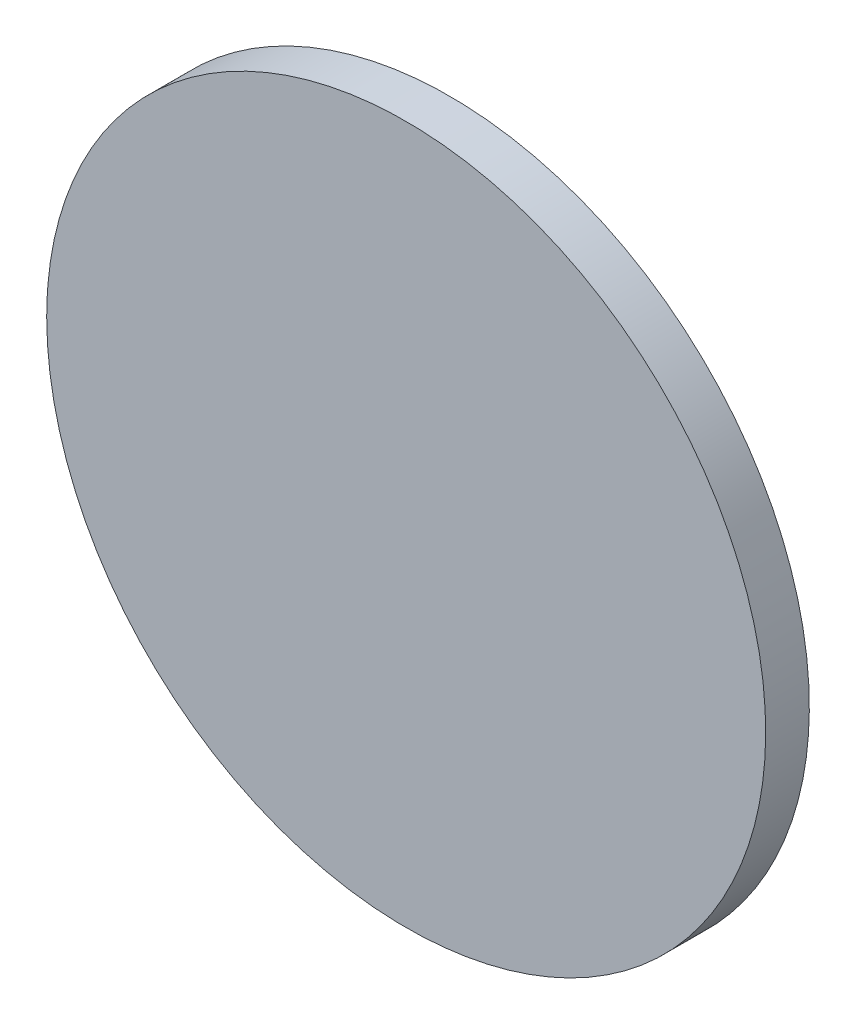
ISO-10303-21;
HEADER;
FILE_DESCRIPTION(('STEP AP214'),'2;1');
FILE_NAME('part.step','',(''),(''),'','','');
FILE_SCHEMA(('AUTOMOTIVE_DESIGN { 1 0 10303 214 1 1 1 1 }'));
ENDSEC;
DATA;
#1=APPLICATION_CONTEXT('core data for automotive mechanical design processes');
#2=APPLICATION_PROTOCOL_DEFINITION('international standard','automotive_design',2000,#1);
#3=PRODUCT_CONTEXT('',#1,'mechanical');
#4=PRODUCT('Part','Part','',(#3));
#5=PRODUCT_RELATED_PRODUCT_CATEGORY('part','',(#4));
#6=PRODUCT_DEFINITION_FORMATION('','',#4);
#7=PRODUCT_DEFINITION_CONTEXT('part definition',#1,'design');
#8=PRODUCT_DEFINITION('design','',#6,#7);
#9=PRODUCT_DEFINITION_SHAPE('','',#8);
#10=(LENGTH_UNIT() NAMED_UNIT(*) SI_UNIT(.MILLI.,.METRE.));
#11=(NAMED_UNIT(*) PLANE_ANGLE_UNIT() SI_UNIT($,.RADIAN.));
#12=(NAMED_UNIT(*) SI_UNIT($,.STERADIAN.) SOLID_ANGLE_UNIT());
#13=UNCERTAINTY_MEASURE_WITH_UNIT(LENGTH_MEASURE(1.E-05),#10,'distance_accuracy_value','');
#14=(GEOMETRIC_REPRESENTATION_CONTEXT(3) GLOBAL_UNCERTAINTY_ASSIGNED_CONTEXT((#13)) GLOBAL_UNIT_ASSIGNED_CONTEXT((#10,
#11,#12)) REPRESENTATION_CONTEXT('',''));
#15=CARTESIAN_POINT('',(0.,0.,0.));
#16=DIRECTION('',(0.,0.,1.));
#17=DIRECTION('',(1.,0.,0.));
#18=AXIS2_PLACEMENT_3D('',#15,#16,#17);
#19=CARTESIAN_POINT('',(0.,0.,3.175));
#20=DIRECTION('',(0.,0.,1.));
#21=DIRECTION('',(-1.,0.,0.));
#22=AXIS2_PLACEMENT_3D('',#19,#20,#21);
#23=ELLIPSE('',#22,26.1547347021971,25.4);
#24=DIRECTION('',(0.,0.,-1.));
#25=VECTOR('',#24,1.);
#26=SURFACE_OF_LINEAR_EXTRUSION('',#23,#25);
#27=CARTESIAN_POINT('',(-26.1547347021971,0.,3.175));
#28=VERTEX_POINT('',#27);
#29=EDGE_CURVE('E10',#28,#28,#23,.T.);
#30=ORIENTED_EDGE('',*,*,#29,.F.);
#31=EDGE_LOOP('',(#30));
#32=FACE_BOUND('',#31,.T.);
#33=CARTESIAN_POINT('',(0.,0.,0.));
#34=DIRECTION('',(0.,0.,1.));
#35=DIRECTION('',(-1.,0.,0.));
#36=AXIS2_PLACEMENT_3D('',#33,#34,#35);
#37=ELLIPSE('',#36,26.1547347021971,25.4);
#38=CARTESIAN_POINT('',(-26.1547347021971,0.,0.));
#39=VERTEX_POINT('',#38);
#40=EDGE_CURVE('E35',#39,#39,#37,.T.);
#41=ORIENTED_EDGE('',*,*,#40,.T.);
#42=EDGE_LOOP('',(#41));
#43=FACE_BOUND('',#42,.T.);
#44=ADVANCED_FACE('F31',(#32,#43),#26,.F.);
#45=CARTESIAN_POINT('',(0.,0.,3.175));
#46=DIRECTION('',(0.,0.,1.));
#47=DIRECTION('',(1.,0.,0.));
#48=AXIS2_PLACEMENT_3D('',#45,#46,#47);
#49=PLANE('',#48);
#50=ORIENTED_EDGE('',*,*,#29,.T.);
#51=EDGE_LOOP('',(#50));
#52=FACE_BOUND('',#51,.T.);
#53=ADVANCED_FACE('F47',(#52),#49,.T.);
#54=CARTESIAN_POINT('',(0.,0.,0.));
#55=DIRECTION('',(0.,0.,1.));
#56=DIRECTION('',(1.,0.,0.));
#57=AXIS2_PLACEMENT_3D('',#54,#55,#56);
#58=PLANE('',#57);
#59=ORIENTED_EDGE('',*,*,#40,.F.);
#60=EDGE_LOOP('',(#59));
#61=FACE_BOUND('',#60,.T.);
#62=ADVANCED_FACE('F45',(#61),#58,.F.);
#63=CLOSED_SHELL('',(#44,#53,#62));
#64=MANIFOLD_SOLID_BREP('B2',#63);
#65=ADVANCED_BREP_SHAPE_REPRESENTATION('',(#18,#64),#14);
#66=SHAPE_DEFINITION_REPRESENTATION(#9,#65);
ENDSEC;
END-ISO-10303-21;
